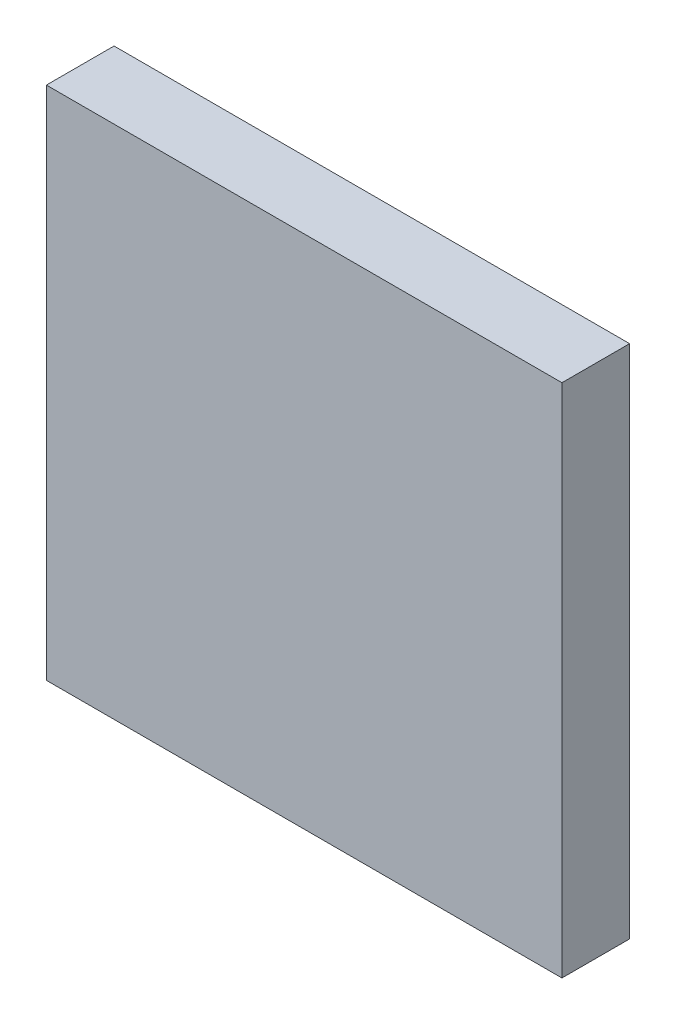
ISO-10303-21;
HEADER;
FILE_DESCRIPTION(('STEP AP214'),'2;1');
FILE_NAME('part.step','',(''),(''),'','','');
FILE_SCHEMA(('AUTOMOTIVE_DESIGN { 1 0 10303 214 1 1 1 1 }'));
ENDSEC;
DATA;
#1=APPLICATION_CONTEXT('core data for automotive mechanical design processes');
#2=APPLICATION_PROTOCOL_DEFINITION('international standard','automotive_design',2000,#1);
#3=PRODUCT_CONTEXT('',#1,'mechanical');
#4=PRODUCT('Part','Part','',(#3));
#5=PRODUCT_RELATED_PRODUCT_CATEGORY('part','',(#4));
#6=PRODUCT_DEFINITION_FORMATION('','',#4);
#7=PRODUCT_DEFINITION_CONTEXT('part definition',#1,'design');
#8=PRODUCT_DEFINITION('design','',#6,#7);
#9=PRODUCT_DEFINITION_SHAPE('','',#8);
#10=(LENGTH_UNIT() NAMED_UNIT(*) SI_UNIT(.MILLI.,.METRE.));
#11=(NAMED_UNIT(*) PLANE_ANGLE_UNIT() SI_UNIT($,.RADIAN.));
#12=(NAMED_UNIT(*) SI_UNIT($,.STERADIAN.) SOLID_ANGLE_UNIT());
#13=UNCERTAINTY_MEASURE_WITH_UNIT(LENGTH_MEASURE(1.E-05),#10,'distance_accuracy_value','');
#14=(GEOMETRIC_REPRESENTATION_CONTEXT(3) GLOBAL_UNCERTAINTY_ASSIGNED_CONTEXT((#13)) GLOBAL_UNIT_ASSIGNED_CONTEXT((#10,
#11,#12)) REPRESENTATION_CONTEXT('',''));
#15=CARTESIAN_POINT('',(0.,0.,0.));
#16=DIRECTION('',(0.,0.,1.));
#17=DIRECTION('',(1.,0.,0.));
#18=AXIS2_PLACEMENT_3D('',#15,#16,#17);
#19=CARTESIAN_POINT('',(0.,-9.475,-22.));
#20=DIRECTION('',(0.,0.,-1.));
#21=DIRECTION('',(0.,1.,0.));
#22=AXIS2_PLACEMENT_3D('',#19,#20,#21);
#23=PLANE('',#22);
#24=CARTESIAN_POINT('',(0.,0.,-22.));
#25=DIRECTION('',(0.,0.,-1.));
#26=DIRECTION('',(-1.,0.,0.));
#27=AXIS2_PLACEMENT_3D('',#24,#25,#26);
#28=CIRCLE('',#27,7.5);
#29=CARTESIAN_POINT('',(-7.5,0.,-22.));
#30=VERTEX_POINT('',#29);
#31=EDGE_CURVE('E11',#30,#30,#28,.F.);
#32=ORIENTED_EDGE('',*,*,#31,.F.);
#33=EDGE_LOOP('',(#32));
#34=FACE_BOUND('',#33,.T.);
#35=ADVANCED_FACE('F35',(#34),#23,.T.);
#36=CARTESIAN_POINT('',(0.,0.,-43.2132034355964));
#37=DIRECTION('',(0.,0.,1.));
#38=DIRECTION('',(1.,0.,0.));
#39=AXIS2_PLACEMENT_3D('',#36,#37,#38);
#40=CYLINDRICAL_SURFACE('',#39,7.5);
#41=CARTESIAN_POINT('',(0.,0.,0.));
#42=DIRECTION('',(0.,0.,1.));
#43=DIRECTION('',(1.,0.,0.));
#44=AXIS2_PLACEMENT_3D('',#41,#42,#43);
#45=CIRCLE('',#44,7.5);
#46=CARTESIAN_POINT('',(7.5,0.,0.));
#47=VERTEX_POINT('',#46);
#48=EDGE_CURVE('E43',#47,#47,#45,.T.);
#49=ORIENTED_EDGE('',*,*,#48,.F.);
#50=EDGE_LOOP('',(#49));
#51=FACE_BOUND('',#50,.T.);
#52=ORIENTED_EDGE('',*,*,#31,.T.);
#53=EDGE_LOOP('',(#52));
#54=FACE_BOUND('',#53,.T.);
#55=ADVANCED_FACE('F122',(#51,#54),#40,.T.);
#56=CARTESIAN_POINT('',(0.,0.,0.));
#57=DIRECTION('',(0.,0.,1.));
#58=DIRECTION('',(1.,0.,0.));
#59=AXIS2_PLACEMENT_3D('',#56,#57,#58);
#60=PLANE('',#59);
#61=ORIENTED_EDGE('',*,*,#48,.T.);
#62=EDGE_LOOP('',(#61));
#63=FACE_BOUND('',#62,.T.);
#64=CARTESIAN_POINT('',(0.,0.,0.));
#65=DIRECTION('',(0.,0.,1.));
#66=DIRECTION('',(1.,0.,0.));
#67=AXIS2_PLACEMENT_3D('',#64,#65,#66);
#68=CIRCLE('',#67,10.);
#69=CARTESIAN_POINT('',(10.,0.,0.));
#70=VERTEX_POINT('',#69);
#71=EDGE_CURVE('E112',#70,#70,#68,.T.);
#72=ORIENTED_EDGE('',*,*,#71,.F.);
#73=EDGE_LOOP('',(#72));
#74=FACE_BOUND('',#73,.T.);
#75=ADVANCED_FACE('F119',(#63,#74),#60,.F.);
#76=CARTESIAN_POINT('',(0.,0.,32.2842712474619));
#77=DIRECTION('',(0.,0.,-1.));
#78=DIRECTION('',(-1.,0.,0.));
#79=AXIS2_PLACEMENT_3D('',#76,#77,#78);
#80=CYLINDRICAL_SURFACE('',#79,10.);
#81=CARTESIAN_POINT('',(0.,0.,3.00000000000001));
#82=DIRECTION('',(0.,0.,-1.));
#83=DIRECTION('',(0.,1.,0.));
#84=AXIS2_PLACEMENT_3D('',#81,#82,#83);
#85=CIRCLE('',#84,10.);
#86=CARTESIAN_POINT('',(0.,10.,3.00000000000001));
#87=VERTEX_POINT('',#86);
#88=EDGE_CURVE('E111',#87,#87,#85,.T.);
#89=ORIENTED_EDGE('',*,*,#88,.T.);
#90=EDGE_LOOP('',(#89));
#91=FACE_BOUND('',#90,.T.);
#92=ORIENTED_EDGE('',*,*,#71,.T.);
#93=EDGE_LOOP('',(#92));
#94=FACE_BOUND('',#93,.T.);
#95=ADVANCED_FACE('F140',(#91,#94),#80,.T.);
#96=CARTESIAN_POINT('',(38.1,38.1,13.));
#97=DIRECTION('',(-1.,0.,0.));
#98=DIRECTION('',(0.,-1.,0.));
#99=AXIS2_PLACEMENT_3D('',#96,#97,#98);
#100=PLANE('',#99);
#101=DIRECTION('',(0.,1.,0.));
#102=VECTOR('',#101,1.);
#103=CARTESIAN_POINT('',(38.1,38.1,3.00000000000001));
#104=LINE('',#103,#102);
#105=CARTESIAN_POINT('',(38.1,-38.1,3.00000000000001));
#106=VERTEX_POINT('',#105);
#107=CARTESIAN_POINT('',(38.1,38.1,3.00000000000001));
#108=VERTEX_POINT('',#107);
#109=EDGE_CURVE('E102',#106,#108,#104,.T.);
#110=ORIENTED_EDGE('',*,*,#109,.T.);
#111=DIRECTION('',(0.,0.,-1.));
#112=VECTOR('',#111,1.);
#113=CARTESIAN_POINT('',(38.1,38.1,13.));
#114=LINE('',#113,#112);
#115=CARTESIAN_POINT('',(38.1,38.1,13.));
#116=VERTEX_POINT('',#115);
#117=EDGE_CURVE('E93',#116,#108,#114,.T.);
#118=ORIENTED_EDGE('',*,*,#117,.F.);
#119=DIRECTION('',(0.,1.,0.));
#120=VECTOR('',#119,1.);
#121=CARTESIAN_POINT('',(38.1,38.1,13.));
#122=LINE('',#121,#120);
#123=CARTESIAN_POINT('',(38.1,-38.1,13.));
#124=VERTEX_POINT('',#123);
#125=EDGE_CURVE('E87',#124,#116,#122,.T.);
#126=ORIENTED_EDGE('',*,*,#125,.F.);
#127=DIRECTION('',(0.,0.,-1.));
#128=VECTOR('',#127,1.);
#129=CARTESIAN_POINT('',(38.1,-38.1,13.));
#130=LINE('',#129,#128);
#131=EDGE_CURVE('E98',#124,#106,#130,.T.);
#132=ORIENTED_EDGE('',*,*,#131,.T.);
#133=EDGE_LOOP('',(#110,#118,#126,#132));
#134=FACE_BOUND('',#133,.T.);
#135=ADVANCED_FACE('F147',(#134),#100,.F.);
#136=CARTESIAN_POINT('',(-38.1,38.1,13.));
#137=DIRECTION('',(0.,-1.,0.));
#138=DIRECTION('',(0.,0.,-1.));
#139=AXIS2_PLACEMENT_3D('',#136,#137,#138);
#140=PLANE('',#139);
#141=DIRECTION('',(-1.,0.,0.));
#142=VECTOR('',#141,1.);
#143=CARTESIAN_POINT('',(-38.1,38.1,3.00000000000001));
#144=LINE('',#143,#142);
#145=CARTESIAN_POINT('',(-38.1,38.1,3.00000000000001));
#146=VERTEX_POINT('',#145);
#147=EDGE_CURVE('E92',#108,#146,#144,.T.);
#148=ORIENTED_EDGE('',*,*,#147,.T.);
#149=DIRECTION('',(0.,0.,-1.));
#150=VECTOR('',#149,1.);
#151=CARTESIAN_POINT('',(-38.1,38.1,13.));
#152=LINE('',#151,#150);
#153=CARTESIAN_POINT('',(-38.1,38.1,13.));
#154=VERTEX_POINT('',#153);
#155=EDGE_CURVE('E90',#154,#146,#152,.T.);
#156=ORIENTED_EDGE('',*,*,#155,.F.);
#157=DIRECTION('',(-1.,0.,0.));
#158=VECTOR('',#157,1.);
#159=CARTESIAN_POINT('',(-38.1,38.1,13.));
#160=LINE('',#159,#158);
#161=EDGE_CURVE('E82',#116,#154,#160,.T.);
#162=ORIENTED_EDGE('',*,*,#161,.F.);
#163=ORIENTED_EDGE('',*,*,#117,.T.);
#164=EDGE_LOOP('',(#148,#156,#162,#163));
#165=FACE_BOUND('',#164,.T.);
#166=ADVANCED_FACE('F91',(#165),#140,.F.);
#167=CARTESIAN_POINT('',(-38.1,38.1,13.));
#168=DIRECTION('',(1.,0.,0.));
#169=DIRECTION('',(0.,1.,0.));
#170=AXIS2_PLACEMENT_3D('',#167,#168,#169);
#171=PLANE('',#170);
#172=DIRECTION('',(0.,-1.,0.));
#173=VECTOR('',#172,1.);
#174=CARTESIAN_POINT('',(-38.1,38.1,3.00000000000001));
#175=LINE('',#174,#173);
#176=CARTESIAN_POINT('',(-38.1,-38.1,3.00000000000001));
#177=VERTEX_POINT('',#176);
#178=EDGE_CURVE('E68',#146,#177,#175,.T.);
#179=ORIENTED_EDGE('',*,*,#178,.T.);
#180=DIRECTION('',(0.,0.,-1.));
#181=VECTOR('',#180,1.);
#182=CARTESIAN_POINT('',(-38.1,-38.1,13.));
#183=LINE('',#182,#181);
#184=CARTESIAN_POINT('',(-38.1,-38.1,13.));
#185=VERTEX_POINT('',#184);
#186=EDGE_CURVE('E94',#185,#177,#183,.T.);
#187=ORIENTED_EDGE('',*,*,#186,.F.);
#188=DIRECTION('',(0.,-1.,0.));
#189=VECTOR('',#188,1.);
#190=CARTESIAN_POINT('',(-38.1,38.1,13.));
#191=LINE('',#190,#189);
#192=EDGE_CURVE('E85',#154,#185,#191,.T.);
#193=ORIENTED_EDGE('',*,*,#192,.F.);
#194=ORIENTED_EDGE('',*,*,#155,.T.);
#195=EDGE_LOOP('',(#179,#187,#193,#194));
#196=FACE_BOUND('',#195,.T.);
#197=ADVANCED_FACE('F96',(#196),#171,.F.);
#198=CARTESIAN_POINT('',(-38.1,-38.1,13.));
#199=DIRECTION('',(0.,1.,0.));
#200=DIRECTION('',(0.,0.,1.));
#201=AXIS2_PLACEMENT_3D('',#198,#199,#200);
#202=PLANE('',#201);
#203=DIRECTION('',(1.,0.,0.));
#204=VECTOR('',#203,1.);
#205=CARTESIAN_POINT('',(-38.1,-38.1,3.00000000000001));
#206=LINE('',#205,#204);
#207=EDGE_CURVE('E74',#177,#106,#206,.T.);
#208=ORIENTED_EDGE('',*,*,#207,.T.);
#209=ORIENTED_EDGE('',*,*,#131,.F.);
#210=DIRECTION('',(1.,0.,0.));
#211=VECTOR('',#210,1.);
#212=CARTESIAN_POINT('',(-38.1,-38.1,13.));
#213=LINE('',#212,#211);
#214=EDGE_CURVE('E51',#185,#124,#213,.T.);
#215=ORIENTED_EDGE('',*,*,#214,.F.);
#216=ORIENTED_EDGE('',*,*,#186,.T.);
#217=EDGE_LOOP('',(#208,#209,#215,#216));
#218=FACE_BOUND('',#217,.T.);
#219=ADVANCED_FACE('F168',(#218),#202,.F.);
#220=CARTESIAN_POINT('',(0.,0.,13.));
#221=DIRECTION('',(0.,0.,1.));
#222=DIRECTION('',(1.,0.,0.));
#223=AXIS2_PLACEMENT_3D('',#220,#221,#222);
#224=PLANE('',#223);
#225=ORIENTED_EDGE('',*,*,#125,.T.);
#226=ORIENTED_EDGE('',*,*,#161,.T.);
#227=ORIENTED_EDGE('',*,*,#192,.T.);
#228=ORIENTED_EDGE('',*,*,#214,.T.);
#229=EDGE_LOOP('',(#225,#226,#227,#228));
#230=FACE_BOUND('',#229,.T.);
#231=ADVANCED_FACE('F83',(#230),#224,.T.);
#232=CARTESIAN_POINT('',(0.,0.,3.00000000000001));
#233=DIRECTION('',(0.,0.,1.));
#234=DIRECTION('',(1.,0.,0.));
#235=AXIS2_PLACEMENT_3D('',#232,#233,#234);
#236=PLANE('',#235);
#237=ORIENTED_EDGE('',*,*,#88,.F.);
#238=EDGE_LOOP('',(#237));
#239=FACE_BOUND('',#238,.T.);
#240=ORIENTED_EDGE('',*,*,#109,.F.);
#241=ORIENTED_EDGE('',*,*,#207,.F.);
#242=ORIENTED_EDGE('',*,*,#178,.F.);
#243=ORIENTED_EDGE('',*,*,#147,.F.);
#244=EDGE_LOOP('',(#240,#241,#242,#243));
#245=FACE_BOUND('',#244,.T.);
#246=ADVANCED_FACE('F181',(#239,#245),#236,.F.);
#247=CLOSED_SHELL('',(#35,#55,#75,#95,#135,#166,#197,#219,#231,#246));
#248=MANIFOLD_SOLID_BREP('B2',#247);
#249=ADVANCED_BREP_SHAPE_REPRESENTATION('',(#18,#248),#14);
#250=SHAPE_DEFINITION_REPRESENTATION(#9,#249);
ENDSEC;
END-ISO-10303-21;
